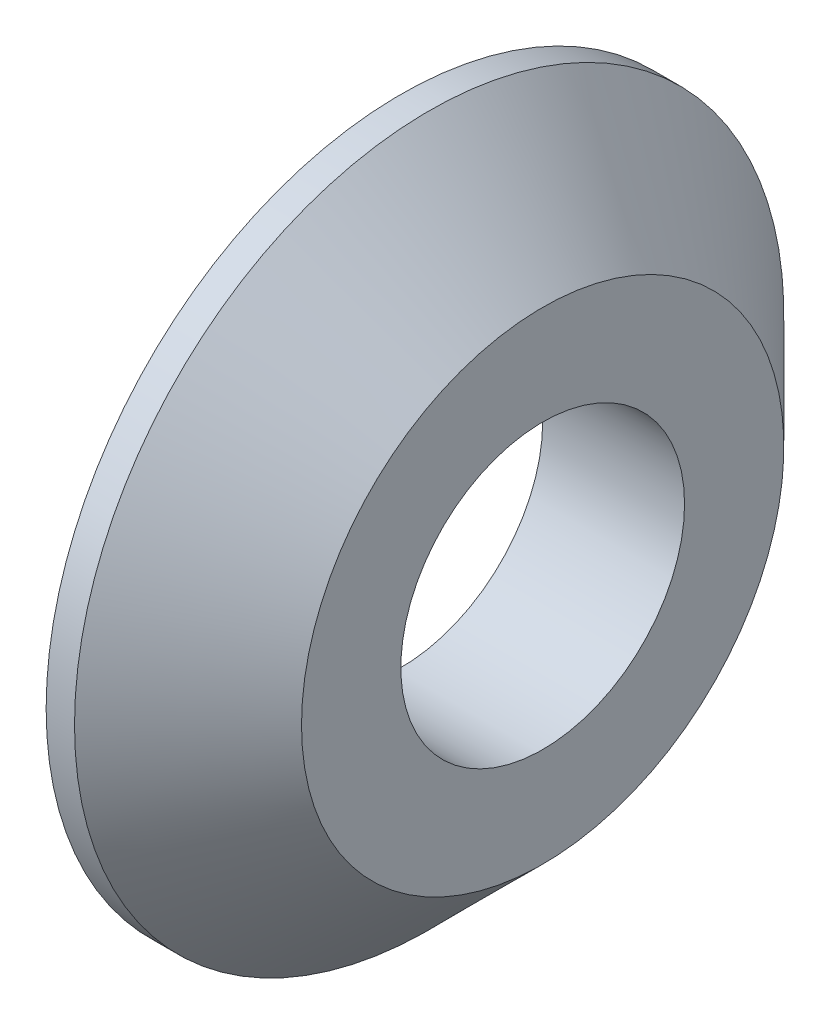
ISO-10303-21;
HEADER;
FILE_DESCRIPTION(('STEP AP214'),'2;1');
FILE_NAME('part.step','',(''),(''),'','','');
FILE_SCHEMA(('AUTOMOTIVE_DESIGN { 1 0 10303 214 1 1 1 1 }'));
ENDSEC;
DATA;
#1=APPLICATION_CONTEXT('core data for automotive mechanical design processes');
#2=APPLICATION_PROTOCOL_DEFINITION('international standard','automotive_design',2000,#1);
#3=PRODUCT_CONTEXT('',#1,'mechanical');
#4=PRODUCT('Part','Part','',(#3));
#5=PRODUCT_RELATED_PRODUCT_CATEGORY('part','',(#4));
#6=PRODUCT_DEFINITION_FORMATION('','',#4);
#7=PRODUCT_DEFINITION_CONTEXT('part definition',#1,'design');
#8=PRODUCT_DEFINITION('design','',#6,#7);
#9=PRODUCT_DEFINITION_SHAPE('','',#8);
#10=(LENGTH_UNIT() NAMED_UNIT(*) SI_UNIT(.MILLI.,.METRE.));
#11=(NAMED_UNIT(*) PLANE_ANGLE_UNIT() SI_UNIT($,.RADIAN.));
#12=(NAMED_UNIT(*) SI_UNIT($,.STERADIAN.) SOLID_ANGLE_UNIT());
#13=UNCERTAINTY_MEASURE_WITH_UNIT(LENGTH_MEASURE(1.E-05),#10,'distance_accuracy_value','');
#14=(GEOMETRIC_REPRESENTATION_CONTEXT(3) GLOBAL_UNCERTAINTY_ASSIGNED_CONTEXT((#13)) GLOBAL_UNIT_ASSIGNED_CONTEXT((#10,
#11,#12)) REPRESENTATION_CONTEXT('',''));
#15=CARTESIAN_POINT('',(0.,0.,0.));
#16=DIRECTION('',(0.,0.,1.));
#17=DIRECTION('',(1.,0.,0.));
#18=AXIS2_PLACEMENT_3D('',#15,#16,#17);
#19=CARTESIAN_POINT('',(0.999999999999997,0.,0.));
#20=DIRECTION('',(-1.,0.,0.));
#21=DIRECTION('',(0.,0.,1.));
#22=AXIS2_PLACEMENT_3D('',#19,#20,#21);
#23=PLANE('',#22);
#24=CARTESIAN_POINT('',(0.999999999999997,0.,0.));
#25=DIRECTION('',(1.,0.,0.));
#26=DIRECTION('',(0.,0.,-1.));
#27=AXIS2_PLACEMENT_3D('',#24,#25,#26);
#28=CIRCLE('',#27,1.);
#29=CARTESIAN_POINT('',(0.999999999999997,0.,-1.));
#30=VERTEX_POINT('',#29);
#31=EDGE_CURVE('E52',#30,#30,#28,.T.);
#32=ORIENTED_EDGE('',*,*,#31,.F.);
#33=EDGE_LOOP('',(#32));
#34=FACE_BOUND('',#33,.T.);
#35=CARTESIAN_POINT('',(0.999999999999994,0.,0.));
#36=DIRECTION('',(-1.,0.,0.));
#37=DIRECTION('',(0.,0.,1.));
#38=AXIS2_PLACEMENT_3D('',#35,#36,#37);
#39=CIRCLE('',#38,1.7);
#40=CARTESIAN_POINT('',(0.999999999999994,0.,1.7));
#41=VERTEX_POINT('',#40);
#42=EDGE_CURVE('E10',#41,#41,#39,.T.);
#43=ORIENTED_EDGE('',*,*,#42,.F.);
#44=EDGE_LOOP('',(#43));
#45=FACE_BOUND('',#44,.T.);
#46=ADVANCED_FACE('F35',(#34,#45),#23,.F.);
#47=CARTESIAN_POINT('',(0.999999999999994,0.,0.));
#48=DIRECTION('',(-1.,0.,0.));
#49=DIRECTION('',(0.,0.,1.));
#50=AXIS2_PLACEMENT_3D('',#47,#48,#49);
#51=CONICAL_SURFACE('',#50,1.7,0.785398163397452);
#52=CARTESIAN_POINT('',(0.2,0.,0.));
#53=DIRECTION('',(-1.,0.,0.));
#54=DIRECTION('',(0.,0.,1.));
#55=AXIS2_PLACEMENT_3D('',#52,#53,#54);
#56=CIRCLE('',#55,2.5);
#57=CARTESIAN_POINT('',(0.2,0.,2.5));
#58=VERTEX_POINT('',#57);
#59=EDGE_CURVE('E41',#58,#58,#56,.T.);
#60=ORIENTED_EDGE('',*,*,#59,.F.);
#61=EDGE_LOOP('',(#60));
#62=FACE_BOUND('',#61,.T.);
#63=ORIENTED_EDGE('',*,*,#42,.T.);
#64=EDGE_LOOP('',(#63));
#65=FACE_BOUND('',#64,.T.);
#66=ADVANCED_FACE('F69',(#62,#65),#51,.T.);
#67=CARTESIAN_POINT('',(0.,0.,0.));
#68=DIRECTION('',(-1.,0.,0.));
#69=DIRECTION('',(0.,0.,1.));
#70=AXIS2_PLACEMENT_3D('',#67,#68,#69);
#71=CYLINDRICAL_SURFACE('',#70,2.5);
#72=CARTESIAN_POINT('',(0.,0.,0.));
#73=DIRECTION('',(-1.,0.,0.));
#74=DIRECTION('',(0.,0.,1.));
#75=AXIS2_PLACEMENT_3D('',#72,#73,#74);
#76=CIRCLE('',#75,2.5);
#77=CARTESIAN_POINT('',(0.,0.,2.5));
#78=VERTEX_POINT('',#77);
#79=EDGE_CURVE('E45',#78,#78,#76,.T.);
#80=ORIENTED_EDGE('',*,*,#79,.F.);
#81=EDGE_LOOP('',(#80));
#82=FACE_BOUND('',#81,.T.);
#83=ORIENTED_EDGE('',*,*,#59,.T.);
#84=EDGE_LOOP('',(#83));
#85=FACE_BOUND('',#84,.T.);
#86=ADVANCED_FACE('F73',(#82,#85),#71,.T.);
#87=CARTESIAN_POINT('',(0.,0.,0.));
#88=DIRECTION('',(1.,0.,0.));
#89=DIRECTION('',(0.,0.,-1.));
#90=AXIS2_PLACEMENT_3D('',#87,#88,#89);
#91=PLANE('',#90);
#92=CARTESIAN_POINT('',(0.,0.,0.));
#93=DIRECTION('',(1.,0.,0.));
#94=DIRECTION('',(0.,0.,-1.));
#95=AXIS2_PLACEMENT_3D('',#92,#93,#94);
#96=CIRCLE('',#95,1.);
#97=CARTESIAN_POINT('',(0.,0.,-1.));
#98=VERTEX_POINT('',#97);
#99=EDGE_CURVE('E49',#98,#98,#96,.T.);
#100=ORIENTED_EDGE('',*,*,#99,.T.);
#101=EDGE_LOOP('',(#100));
#102=FACE_BOUND('',#101,.T.);
#103=ORIENTED_EDGE('',*,*,#79,.T.);
#104=EDGE_LOOP('',(#103));
#105=FACE_BOUND('',#104,.T.);
#106=ADVANCED_FACE('F58',(#102,#105),#91,.F.);
#107=CARTESIAN_POINT('',(0.,0.,0.));
#108=DIRECTION('',(1.,0.,0.));
#109=DIRECTION('',(0.,0.,-1.));
#110=AXIS2_PLACEMENT_3D('',#107,#108,#109);
#111=CYLINDRICAL_SURFACE('',#110,1.);
#112=ORIENTED_EDGE('',*,*,#99,.F.);
#113=EDGE_LOOP('',(#112));
#114=FACE_BOUND('',#113,.T.);
#115=ORIENTED_EDGE('',*,*,#31,.T.);
#116=EDGE_LOOP('',(#115));
#117=FACE_BOUND('',#116,.T.);
#118=ADVANCED_FACE('F61',(#114,#117),#111,.F.);
#119=CLOSED_SHELL('',(#46,#66,#86,#106,#118));
#120=MANIFOLD_SOLID_BREP('B2',#119);
#121=ADVANCED_BREP_SHAPE_REPRESENTATION('',(#18,#120),#14);
#122=SHAPE_DEFINITION_REPRESENTATION(#9,#121);
ENDSEC;
END-ISO-10303-21;
